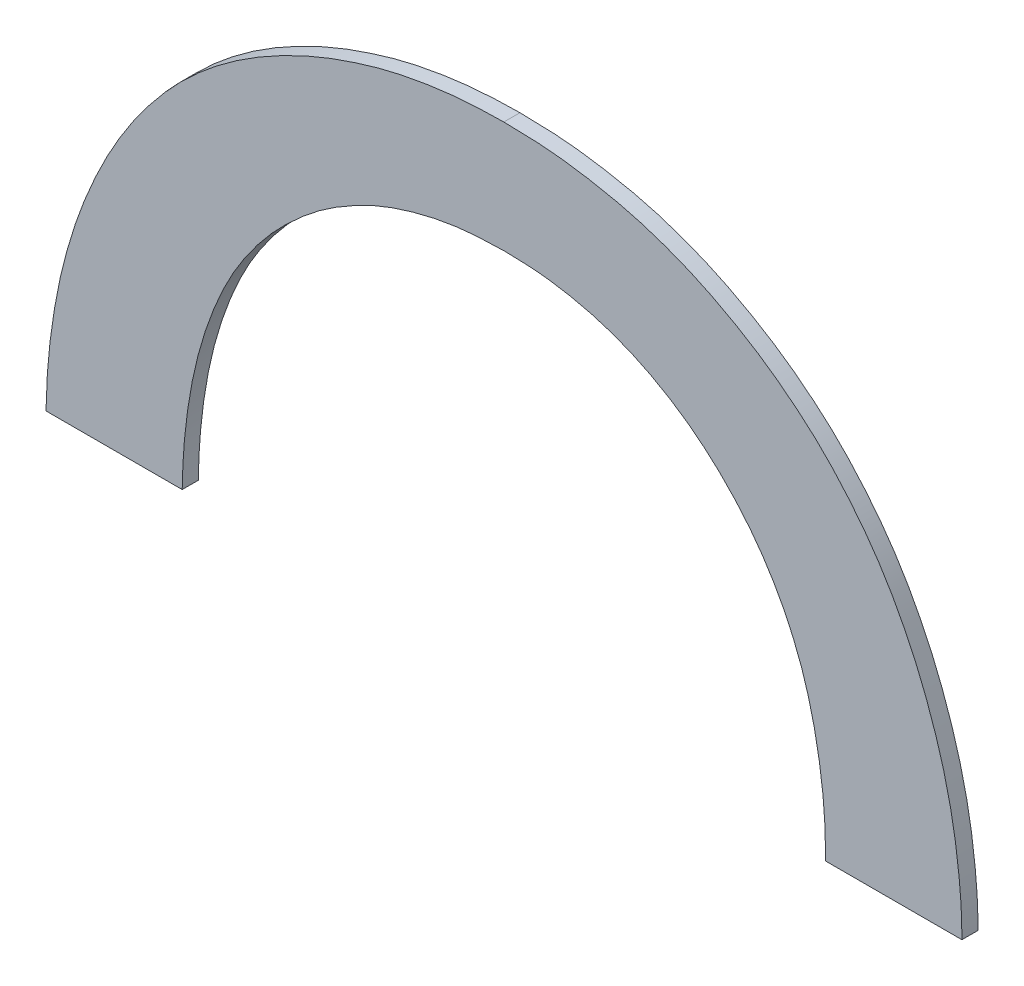
ISO-10303-21;
HEADER;
FILE_DESCRIPTION(('STEP AP214'),'2;1');
FILE_NAME('part.step','',(''),(''),'','','');
FILE_SCHEMA(('AUTOMOTIVE_DESIGN { 1 0 10303 214 1 1 1 1 }'));
ENDSEC;
DATA;
#1=APPLICATION_CONTEXT('core data for automotive mechanical design processes');
#2=APPLICATION_PROTOCOL_DEFINITION('international standard','automotive_design',2000,#1);
#3=PRODUCT_CONTEXT('',#1,'mechanical');
#4=PRODUCT('Part','Part','',(#3));
#5=PRODUCT_RELATED_PRODUCT_CATEGORY('part','',(#4));
#6=PRODUCT_DEFINITION_FORMATION('','',#4);
#7=PRODUCT_DEFINITION_CONTEXT('part definition',#1,'design');
#8=PRODUCT_DEFINITION('design','',#6,#7);
#9=PRODUCT_DEFINITION_SHAPE('','',#8);
#10=(LENGTH_UNIT() NAMED_UNIT(*) SI_UNIT(.MILLI.,.METRE.));
#11=(NAMED_UNIT(*) PLANE_ANGLE_UNIT() SI_UNIT($,.RADIAN.));
#12=(NAMED_UNIT(*) SI_UNIT($,.STERADIAN.) SOLID_ANGLE_UNIT());
#13=UNCERTAINTY_MEASURE_WITH_UNIT(LENGTH_MEASURE(1.E-05),#10,'distance_accuracy_value','');
#14=(GEOMETRIC_REPRESENTATION_CONTEXT(3) GLOBAL_UNCERTAINTY_ASSIGNED_CONTEXT((#13)) GLOBAL_UNIT_ASSIGNED_CONTEXT((#10,
#11,#12)) REPRESENTATION_CONTEXT('',''));
#15=CARTESIAN_POINT('',(0.,0.,0.));
#16=DIRECTION('',(0.,0.,1.));
#17=DIRECTION('',(1.,0.,0.));
#18=AXIS2_PLACEMENT_3D('',#15,#16,#17);
#19=CARTESIAN_POINT('',(10.3525266492303,11.0243893653808,0.5));
#20=DIRECTION('',(0.,0.,1.));
#21=DIRECTION('',(1.,0.,0.));
#22=AXIS2_PLACEMENT_3D('',#19,#20,#21);
#23=PLANE('',#22);
#24=CARTESIAN_POINT('',(0.,15.3846153846154,0.5));
#25=CARTESIAN_POINT('',(0.344753220200929,15.3792741721511,0.5));
#26=CARTESIAN_POINT('',(1.02762300983373,15.3686945679062,0.5));
#27=CARTESIAN_POINT('',(2.03798960421313,15.2712905777936,0.5));
#28=CARTESIAN_POINT('',(3.01987915428358,15.1045464256907,0.5));
#29=CARTESIAN_POINT('',(3.97890854159104,14.89523667203,0.5));
#30=CARTESIAN_POINT('',(4.90440549489051,14.6013720957114,0.5));
#31=CARTESIAN_POINT('',(5.80411363734744,14.2551272073144,0.5));
#32=CARTESIAN_POINT('',(6.67136292867436,13.8361192631119,0.5));
#33=CARTESIAN_POINT('',(7.51060874059996,13.3627869876404,0.5));
#34=CARTESIAN_POINT('',(8.31433313373731,12.8380286756876,0.5));
#35=CARTESIAN_POINT('',(9.06549584858372,12.2567927109984,0.5));
#36=CARTESIAN_POINT('',(9.77518030991208,11.6394887446928,0.5));
#37=CARTESIAN_POINT('',(10.4217724590289,10.9621836503208,0.5));
#38=CARTESIAN_POINT('',(11.0246372081747,10.2460658482216,0.5));
#39=CARTESIAN_POINT('',(11.5817499222166,9.48492067085225,0.5));
#40=CARTESIAN_POINT('',(12.0852386965378,8.67493533142775,0.5));
#41=CARTESIAN_POINT('',(12.5323134067004,7.82044261361452,0.5));
#42=CARTESIAN_POINT('',(12.9354561659615,6.94312771420891,0.5));
#43=CARTESIAN_POINT('',(13.2752965683784,6.04344848223068,0.5));
#44=CARTESIAN_POINT('',(13.5739000583611,5.13446643127678,0.5));
#45=CARTESIAN_POINT('',(13.8117199526514,4.21063152423738,0.5));
#46=CARTESIAN_POINT('',(14.0012301384877,3.27406085760122,0.5));
#47=CARTESIAN_POINT('',(14.128662792464,2.32631659269619,0.5));
#48=CARTESIAN_POINT('',(14.2206954019419,1.36598622398732,0.5));
#49=CARTESIAN_POINT('',(14.2273943895153,0.721377853966235,0.5));
#50=CARTESIAN_POINT('',(14.2307692307692,0.396634615384615,0.5));
#51=B_SPLINE_CURVE_WITH_KNOTS('',3,(#24,#25,#26,#27,#28,#29,#30,#31,#32,#33,#34,#35,#36,#37,#38,
#39,#40,#41,#42,#43,#44,#45,#46,#47,#48,#49,#50),.UNSPECIFIED.,.F.,.F.,(4,1,1,1,1,1,1,1,1,1,1,1,
1,1,1,1,1,1,1,1,1,1,1,1,4),(0.,0.0447019208074968,0.0885433100239245,0.131465288215882,
0.17381664158036,0.215721845749897,0.257259045342728,0.298740966032636,0.340501781719904,
0.38214850876387,0.423093318019024,0.463588147888226,0.504007911583259,0.544388418588891,
0.584918231759648,0.626224069925554,0.667942846682859,0.709910813343168,0.751354483462901,
0.792595733312486,0.833930154293738,0.874994289638587,0.916436331291352,0.957901979455649,1.),.UNSPECIFIED.);
#52=CARTESIAN_POINT('',(0.,15.3846153846154,0.5));
#53=VERTEX_POINT('',#52);
#54=CARTESIAN_POINT('',(14.2296783956234,0.5,0.5));
#55=VERTEX_POINT('',#54);
#56=EDGE_CURVE('E100',#53,#55,#51,.T.);
#57=ORIENTED_EDGE('',*,*,#56,.T.);
#58=DIRECTION('',(-1.,0.,0.));
#59=VECTOR('',#58,1.);
#60=CARTESIAN_POINT('',(10.3525266492303,0.5,0.5));
#61=LINE('',#60,#59);
#62=CARTESIAN_POINT('',(9.99917109614636,0.5,0.5));
#63=VERTEX_POINT('',#62);
#64=EDGE_CURVE('E114',#55,#63,#61,.T.);
#65=ORIENTED_EDGE('',*,*,#64,.T.);
#66=CARTESIAN_POINT('',(10.,0.444711538461538,0.5));
#67=CARTESIAN_POINT('',(9.99352021892729,0.877829097718419,0.5));
#68=CARTESIAN_POINT('',(9.98088510314185,1.72237777127866,0.5));
#69=CARTESIAN_POINT('',(9.83619969510625,2.95365295059749,0.5));
#70=CARTESIAN_POINT('',(9.61692087018172,4.11554271981961,0.5));
#71=CARTESIAN_POINT('',(9.31378365985646,5.21076418509407,0.5));
#72=CARTESIAN_POINT('',(8.90905851420964,6.23126610931418,0.5));
#73=CARTESIAN_POINT('',(8.41423432900512,7.17900816005998,0.5));
#74=CARTESIAN_POINT('',(7.83379331998171,8.05846989124861,0.5));
#75=CARTESIAN_POINT('',(7.1680409104972,8.85968466447942,0.5));
#76=CARTESIAN_POINT('',(6.43652575358211,9.57968354616591,0.5));
#77=CARTESIAN_POINT('',(5.65481474581481,10.20883934601,0.5));
#78=CARTESIAN_POINT('',(4.82363410622038,10.7334705604199,0.5));
#79=CARTESIAN_POINT('',(3.95398854765655,11.1716737690888,0.5));
#80=CARTESIAN_POINT('',(3.03434768870847,11.5093077347265,0.5));
#81=CARTESIAN_POINT('',(2.06911748935067,11.7479847028569,0.5));
#82=CARTESIAN_POINT('',(1.0583168845666,11.896964656081,0.5));
#83=CARTESIAN_POINT('',(0.369111702242908,11.9142643933377,0.5));
#84=CARTESIAN_POINT('',(0.0180288461538412,11.9230769230769,0.5));
#85=B_SPLINE_CURVE_WITH_KNOTS('',3,(#66,#67,#68,#69,#70,#71,#72,#73,#74,#75,#76,#77,#78,#79,#80,
#81,#82,#83,#84),.UNSPECIFIED.,.F.,.F.,(4,1,1,1,1,1,1,1,1,1,1,1,1,1,1,1,4),(0.,
0.0759760013778242,0.148147840729764,0.217233774793934,0.283343165506864,0.347254881251357,
0.409524007156626,0.470659415698186,0.531831202337304,0.591991495477476,0.650519001859518,
0.70757300758043,0.764172461786213,0.821120223613073,0.879100355202932,0.938413416375657,1.),.UNSPECIFIED.);
#86=CARTESIAN_POINT('',(0.0180288461538412,11.9230769230769,0.500000000000001));
#87=VERTEX_POINT('',#86);
#88=EDGE_CURVE('E117',#63,#87,#85,.T.);
#89=ORIENTED_EDGE('',*,*,#88,.T.);
#90=CARTESIAN_POINT('',(0.0180288461538412,11.9230769230769,0.5));
#91=CARTESIAN_POINT('',(-0.339008040595541,11.9141404113355,0.5));
#92=CARTESIAN_POINT('',(-1.03808525839421,11.8966427465369,0.5));
#93=CARTESIAN_POINT('',(-2.06408025768524,11.750176047351,0.5));
#94=CARTESIAN_POINT('',(-3.03889044603037,11.5008227708652,0.5));
#95=CARTESIAN_POINT('',(-3.97217752811076,11.1688769531684,0.5));
#96=CARTESIAN_POINT('',(-4.84707006275444,10.7201432432575,0.5));
#97=CARTESIAN_POINT('',(-5.68402368648533,10.1946769013211,0.5));
#98=CARTESIAN_POINT('',(-6.46024410726022,9.55257835313462,0.5));
#99=CARTESIAN_POINT('',(-7.19470277260044,8.83128490656962,0.5));
#100=CARTESIAN_POINT('',(-7.85370899288998,8.01149444458212,0.5));
#101=CARTESIAN_POINT('',(-8.4374977705082,7.11297080782485,0.5));
#102=CARTESIAN_POINT('',(-8.91499845115373,6.12454814133799,0.5));
#103=CARTESIAN_POINT('',(-9.31331960527374,5.0604414301481,0.5));
#104=CARTESIAN_POINT('',(-9.62576962172589,3.91397278976917,0.5));
#105=CARTESIAN_POINT('',(-9.84420143624477,2.68515228332696,0.5));
#106=CARTESIAN_POINT('',(-9.9789065538802,1.37721909028968,0.5));
#107=CARTESIAN_POINT('',(-9.99284452660626,0.479103322733377,0.5));
#108=CARTESIAN_POINT('',(-10.,0.0180288461538464,0.5));
#109=B_SPLINE_CURVE_WITH_KNOTS('',3,(#90,#91,#92,#93,#94,#95,#96,#97,#98,#99,#100,#101,#102,
#103,#104,#105,#106,#107,#108),.UNSPECIFIED.,.F.,.F.,(4,1,1,1,1,1,1,1,1,1,1,1,1,1,1,1,4),(0.,
0.0610568331758596,0.119549107244312,0.176811920441053,0.232963814303857,0.288592571832019,
0.344677508575926,0.401674151352184,0.460554590765406,0.520493442029477,0.581231156452735,
0.643451008851642,0.707862032340736,0.775363674324027,0.846408843832957,0.9211494057947,1.),.UNSPECIFIED.);
#110=CARTESIAN_POINT('',(-9.99164782223736,0.499999999999184,0.5));
#111=VERTEX_POINT('',#110);
#112=EDGE_CURVE('E149',#87,#111,#109,.T.);
#113=ORIENTED_EDGE('',*,*,#112,.T.);
#114=CARTESIAN_POINT('',(-14.2224442114594,0.5,0.5));
#115=VERTEX_POINT('',#114);
#116=EDGE_CURVE('E80',#111,#115,#61,.T.);
#117=ORIENTED_EDGE('',*,*,#116,.T.);
#118=CARTESIAN_POINT('',(-14.2307692307692,0.0480769230769233,0.5));
#119=CARTESIAN_POINT('',(-14.2245185235357,0.420809036747173,0.5));
#120=CARTESIAN_POINT('',(-14.2121691736018,1.15720559657745,0.5));
#121=CARTESIAN_POINT('',(-14.1286084187029,2.24508862312763,0.5));
#122=CARTESIAN_POINT('',(-13.9816795673641,3.30174078414195,0.5));
#123=CARTESIAN_POINT('',(-13.7868034616448,4.33031282561474,0.5));
#124=CARTESIAN_POINT('',(-13.5256754306759,5.32866347319633,0.5));
#125=CARTESIAN_POINT('',(-13.215364889533,6.29965506418861,0.5));
#126=CARTESIAN_POINT('',(-12.8400267745373,7.23750416109316,0.5));
#127=CARTESIAN_POINT('',(-12.4161239875513,8.14447123976062,0.5));
#128=CARTESIAN_POINT('',(-11.9364783762358,9.00808211626406,0.5));
#129=CARTESIAN_POINT('',(-11.4073959542526,9.82229888659056,0.5));
#130=CARTESIAN_POINT('',(-10.8285053749589,10.579502035299,0.5));
#131=CARTESIAN_POINT('',(-10.2085872736321,11.2889920904243,0.5));
#132=CARTESIAN_POINT('',(-9.53524756709915,11.936083209771,0.5));
#133=CARTESIAN_POINT('',(-8.81368718160546,12.5304069168618,0.5));
#134=CARTESIAN_POINT('',(-8.04538168279164,13.0694060831132,0.5));
#135=CARTESIAN_POINT('',(-7.23334269410256,13.5562599990873,0.5));
#136=CARTESIAN_POINT('',(-6.39054380837594,13.9843498279604,0.5));
#137=CARTESIAN_POINT('',(-5.52721831281684,14.362662410738,0.5));
#138=CARTESIAN_POINT('',(-4.64234803529465,14.6687496998762,0.5));
#139=CARTESIAN_POINT('',(-3.74887879752086,14.9402358589999,0.5));
#140=CARTESIAN_POINT('',(-2.83350619956188,15.1354482666034,0.500000000000001));
#141=CARTESIAN_POINT('',(-1.90486176994163,15.2809129777081,0.499999999999999));
#142=CARTESIAN_POINT('',(-0.95711101538129,15.3659735209081,0.5));
#143=CARTESIAN_POINT('',(-0.320676423354294,15.3783694987336,0.5));
#144=CARTESIAN_POINT('',(0.,15.3846153846154,0.5));
#145=B_SPLINE_CURVE_WITH_KNOTS('',3,(#118,#119,#120,#121,#122,#123,#124,#125,#126,#127,#128,
#129,#130,#131,#132,#133,#134,#135,#136,#137,#138,#139,#140,#141,#142,#143,#144),.UNSPECIFIED.,
.F.,.F.,(4,1,1,1,1,1,1,1,1,1,1,1,1,1,1,1,1,1,1,1,1,1,1,1,4),(0.,0.0475607904469535,
0.0939645423171941,0.139115141345361,0.183631072801197,0.227462927902264,0.270709531701966,
0.313618666161367,0.356269691332142,0.398376485288319,0.439567915657715,0.480057833850516,
0.519901979935957,0.559672266034351,0.599076979077249,0.639073336918097,0.679315608028187,
0.719783735968342,0.759623782313469,0.799480225089592,0.839192146933082,0.87870035522447,
0.918792163087699,0.959082301597663,1.),.UNSPECIFIED.);
#146=EDGE_CURVE('E93',#115,#53,#145,.T.);
#147=ORIENTED_EDGE('',*,*,#146,.T.);
#148=EDGE_LOOP('',(#57,#65,#89,#113,#117,#147));
#149=FACE_BOUND('',#148,.T.);
#150=ADVANCED_FACE('F39',(#149),#23,.F.);
#151=CARTESIAN_POINT('',(10.3525266492303,11.0243893653808,1.));
#152=DIRECTION('',(0.,0.,1.));
#153=DIRECTION('',(1.,0.,0.));
#154=AXIS2_PLACEMENT_3D('',#151,#152,#153);
#155=PLANE('',#154);
#156=CARTESIAN_POINT('',(-14.2307692307692,0.0480769230769233,1.));
#157=CARTESIAN_POINT('',(-14.2245185235357,0.420809036747173,1.));
#158=CARTESIAN_POINT('',(-14.2121691736018,1.15720559657745,1.));
#159=CARTESIAN_POINT('',(-14.1286084187029,2.24508862312763,1.));
#160=CARTESIAN_POINT('',(-13.9816795673641,3.30174078414195,1.));
#161=CARTESIAN_POINT('',(-13.7868034616448,4.33031282561474,1.));
#162=CARTESIAN_POINT('',(-13.5256754306759,5.32866347319633,1.));
#163=CARTESIAN_POINT('',(-13.215364889533,6.29965506418861,1.));
#164=CARTESIAN_POINT('',(-12.8400267745373,7.23750416109316,1.));
#165=CARTESIAN_POINT('',(-12.4161239875513,8.14447123976062,1.));
#166=CARTESIAN_POINT('',(-11.9364783762358,9.00808211626406,1.));
#167=CARTESIAN_POINT('',(-11.4073959542526,9.82229888659056,1.));
#168=CARTESIAN_POINT('',(-10.8285053749589,10.579502035299,1.));
#169=CARTESIAN_POINT('',(-10.2085872736321,11.2889920904243,1.));
#170=CARTESIAN_POINT('',(-9.53524756709915,11.936083209771,1.));
#171=CARTESIAN_POINT('',(-8.81368718160546,12.5304069168618,1.));
#172=CARTESIAN_POINT('',(-8.04538168279164,13.0694060831132,1.));
#173=CARTESIAN_POINT('',(-7.23334269410256,13.5562599990873,1.));
#174=CARTESIAN_POINT('',(-6.39054380837594,13.9843498279604,1.));
#175=CARTESIAN_POINT('',(-5.52721831281684,14.362662410738,1.));
#176=CARTESIAN_POINT('',(-4.64234803529465,14.6687496998762,1.));
#177=CARTESIAN_POINT('',(-3.74887879752086,14.9402358589999,1.));
#178=CARTESIAN_POINT('',(-2.83350619956188,15.1354482666034,1.));
#179=CARTESIAN_POINT('',(-1.90486176994163,15.2809129777081,0.999999999999999));
#180=CARTESIAN_POINT('',(-0.95711101538129,15.3659735209081,1.));
#181=CARTESIAN_POINT('',(-0.320676423354294,15.3783694987336,1.));
#182=CARTESIAN_POINT('',(0.,15.3846153846154,1.));
#183=B_SPLINE_CURVE_WITH_KNOTS('',3,(#156,#157,#158,#159,#160,#161,#162,#163,#164,#165,#166,
#167,#168,#169,#170,#171,#172,#173,#174,#175,#176,#177,#178,#179,#180,#181,#182),.UNSPECIFIED.,
.F.,.F.,(4,1,1,1,1,1,1,1,1,1,1,1,1,1,1,1,1,1,1,1,1,1,1,1,4),(0.,0.0475607904469535,
0.0939645423171941,0.139115141345361,0.183631072801197,0.227462927902264,0.270709531701966,
0.313618666161367,0.356269691332142,0.398376485288319,0.439567915657715,0.480057833850516,
0.519901979935957,0.559672266034351,0.599076979077249,0.639073336918097,0.679315608028187,
0.719783735968342,0.759623782313469,0.799480225089592,0.839192146933082,0.87870035522447,
0.918792163087699,0.959082301597663,1.),.UNSPECIFIED.);
#184=CARTESIAN_POINT('',(-14.2224442114594,0.5,1.));
#185=VERTEX_POINT('',#184);
#186=CARTESIAN_POINT('',(0.,15.3846153846154,1.));
#187=VERTEX_POINT('',#186);
#188=EDGE_CURVE('E107',#185,#187,#183,.T.);
#189=ORIENTED_EDGE('',*,*,#188,.F.);
#190=DIRECTION('',(1.,0.,0.));
#191=VECTOR('',#190,1.);
#192=CARTESIAN_POINT('',(-17.,0.5,1.));
#193=LINE('',#192,#191);
#194=CARTESIAN_POINT('',(-9.99164782223735,0.5,1.));
#195=VERTEX_POINT('',#194);
#196=EDGE_CURVE('E99',#185,#195,#193,.T.);
#197=ORIENTED_EDGE('',*,*,#196,.T.);
#198=CARTESIAN_POINT('',(0.0180288461538412,11.9230769230769,1.));
#199=CARTESIAN_POINT('',(-0.339008040595541,11.9141404113355,1.));
#200=CARTESIAN_POINT('',(-1.03808525839421,11.8966427465369,1.));
#201=CARTESIAN_POINT('',(-2.06408025768524,11.750176047351,1.));
#202=CARTESIAN_POINT('',(-3.03889044603037,11.5008227708652,1.));
#203=CARTESIAN_POINT('',(-3.97217752811076,11.1688769531684,1.));
#204=CARTESIAN_POINT('',(-4.84707006275444,10.7201432432575,1.));
#205=CARTESIAN_POINT('',(-5.68402368648533,10.1946769013211,1.));
#206=CARTESIAN_POINT('',(-6.46024410726022,9.55257835313462,1.));
#207=CARTESIAN_POINT('',(-7.19470277260044,8.83128490656962,1.));
#208=CARTESIAN_POINT('',(-7.85370899288998,8.01149444458212,1.));
#209=CARTESIAN_POINT('',(-8.4374977705082,7.11297080782485,1.));
#210=CARTESIAN_POINT('',(-8.91499845115373,6.12454814133799,1.));
#211=CARTESIAN_POINT('',(-9.31331960527374,5.0604414301481,1.));
#212=CARTESIAN_POINT('',(-9.62576962172589,3.91397278976917,1.));
#213=CARTESIAN_POINT('',(-9.84420143624477,2.68515228332696,1.));
#214=CARTESIAN_POINT('',(-9.9789065538802,1.37721909028968,1.));
#215=CARTESIAN_POINT('',(-9.99284452660626,0.479103322733377,1.));
#216=CARTESIAN_POINT('',(-10.,0.0180288461538464,1.));
#217=B_SPLINE_CURVE_WITH_KNOTS('',3,(#198,#199,#200,#201,#202,#203,#204,#205,#206,#207,#208,
#209,#210,#211,#212,#213,#214,#215,#216),.UNSPECIFIED.,.F.,.F.,(4,1,1,1,1,1,1,1,1,1,1,1,1,1,1,1,
4),(0.,0.0610568331758596,0.119549107244312,0.176811920441053,0.232963814303857,
0.288592571832019,0.344677508575926,0.401674151352184,0.460554590765406,0.520493442029477,
0.581231156452735,0.643451008851642,0.707862032340736,0.775363674324027,0.846408843832957,
0.9211494057947,1.),.UNSPECIFIED.);
#218=CARTESIAN_POINT('',(0.0180288461538412,11.9230769230769,1.));
#219=VERTEX_POINT('',#218);
#220=EDGE_CURVE('E160',#219,#195,#217,.T.);
#221=ORIENTED_EDGE('',*,*,#220,.F.);
#222=CARTESIAN_POINT('',(10.,0.444711538461538,1.));
#223=CARTESIAN_POINT('',(9.99352021892729,0.877829097718419,1.));
#224=CARTESIAN_POINT('',(9.98088510314185,1.72237777127866,1.));
#225=CARTESIAN_POINT('',(9.83619969510625,2.95365295059749,1.));
#226=CARTESIAN_POINT('',(9.61692087018172,4.11554271981961,1.));
#227=CARTESIAN_POINT('',(9.31378365985646,5.21076418509407,1.));
#228=CARTESIAN_POINT('',(8.90905851420964,6.23126610931418,1.));
#229=CARTESIAN_POINT('',(8.41423432900512,7.17900816005998,1.));
#230=CARTESIAN_POINT('',(7.83379331998171,8.05846989124861,1.));
#231=CARTESIAN_POINT('',(7.1680409104972,8.85968466447942,1.));
#232=CARTESIAN_POINT('',(6.43652575358211,9.57968354616591,1.));
#233=CARTESIAN_POINT('',(5.65481474581481,10.20883934601,1.));
#234=CARTESIAN_POINT('',(4.82363410622038,10.7334705604199,1.));
#235=CARTESIAN_POINT('',(3.95398854765655,11.1716737690888,1.));
#236=CARTESIAN_POINT('',(3.03434768870847,11.5093077347265,1.));
#237=CARTESIAN_POINT('',(2.06911748935067,11.7479847028569,1.));
#238=CARTESIAN_POINT('',(1.0583168845666,11.896964656081,1.));
#239=CARTESIAN_POINT('',(0.369111702242908,11.9142643933377,1.));
#240=CARTESIAN_POINT('',(0.0180288461538412,11.9230769230769,1.));
#241=B_SPLINE_CURVE_WITH_KNOTS('',3,(#222,#223,#224,#225,#226,#227,#228,#229,#230,#231,#232,
#233,#234,#235,#236,#237,#238,#239,#240),.UNSPECIFIED.,.F.,.F.,(4,1,1,1,1,1,1,1,1,1,1,1,1,1,1,1,
4),(0.,0.0759760013778242,0.148147840729764,0.217233774793934,0.283343165506864,
0.347254881251357,0.409524007156626,0.470659415698186,0.531831202337304,0.591991495477476,
0.650519001859518,0.70757300758043,0.764172461786213,0.821120223613073,0.879100355202932,
0.938413416375657,1.),.UNSPECIFIED.);
#242=CARTESIAN_POINT('',(9.99917109614636,0.5,1.));
#243=VERTEX_POINT('',#242);
#244=EDGE_CURVE('E11',#243,#219,#241,.T.);
#245=ORIENTED_EDGE('',*,*,#244,.F.);
#246=CARTESIAN_POINT('',(14.2296783956234,0.5,1.));
#247=VERTEX_POINT('',#246);
#248=EDGE_CURVE('E43',#243,#247,#193,.T.);
#249=ORIENTED_EDGE('',*,*,#248,.T.);
#250=CARTESIAN_POINT('',(0.,15.3846153846154,1.));
#251=CARTESIAN_POINT('',(0.344753220200929,15.3792741721511,1.));
#252=CARTESIAN_POINT('',(1.02762300983373,15.3686945679062,1.));
#253=CARTESIAN_POINT('',(2.03798960421313,15.2712905777936,1.));
#254=CARTESIAN_POINT('',(3.01987915428358,15.1045464256907,1.));
#255=CARTESIAN_POINT('',(3.97890854159104,14.89523667203,1.));
#256=CARTESIAN_POINT('',(4.90440549489051,14.6013720957114,1.));
#257=CARTESIAN_POINT('',(5.80411363734744,14.2551272073144,1.));
#258=CARTESIAN_POINT('',(6.67136292867436,13.8361192631119,1.));
#259=CARTESIAN_POINT('',(7.51060874059996,13.3627869876404,1.));
#260=CARTESIAN_POINT('',(8.31433313373731,12.8380286756876,1.));
#261=CARTESIAN_POINT('',(9.06549584858372,12.2567927109984,1.));
#262=CARTESIAN_POINT('',(9.77518030991208,11.6394887446928,1.));
#263=CARTESIAN_POINT('',(10.4217724590289,10.9621836503208,1.));
#264=CARTESIAN_POINT('',(11.0246372081747,10.2460658482216,1.));
#265=CARTESIAN_POINT('',(11.5817499222166,9.48492067085225,1.));
#266=CARTESIAN_POINT('',(12.0852386965378,8.67493533142775,1.));
#267=CARTESIAN_POINT('',(12.5323134067004,7.82044261361452,1.));
#268=CARTESIAN_POINT('',(12.9354561659615,6.94312771420891,1.));
#269=CARTESIAN_POINT('',(13.2752965683784,6.04344848223068,1.));
#270=CARTESIAN_POINT('',(13.5739000583611,5.13446643127678,1.));
#271=CARTESIAN_POINT('',(13.8117199526514,4.21063152423738,1.));
#272=CARTESIAN_POINT('',(14.0012301384877,3.27406085760122,1.));
#273=CARTESIAN_POINT('',(14.128662792464,2.32631659269619,1.));
#274=CARTESIAN_POINT('',(14.2206954019419,1.36598622398732,1.));
#275=CARTESIAN_POINT('',(14.2273943895153,0.721377853966235,1.));
#276=CARTESIAN_POINT('',(14.2307692307692,0.396634615384615,1.));
#277=B_SPLINE_CURVE_WITH_KNOTS('',3,(#250,#251,#252,#253,#254,#255,#256,#257,#258,#259,#260,
#261,#262,#263,#264,#265,#266,#267,#268,#269,#270,#271,#272,#273,#274,#275,#276),.UNSPECIFIED.,
.F.,.F.,(4,1,1,1,1,1,1,1,1,1,1,1,1,1,1,1,1,1,1,1,1,1,1,1,4),(0.,0.0447019208074968,
0.0885433100239245,0.131465288215882,0.17381664158036,0.215721845749897,0.257259045342728,
0.298740966032636,0.340501781719904,0.38214850876387,0.423093318019024,0.463588147888226,
0.504007911583259,0.544388418588891,0.584918231759648,0.626224069925554,0.667942846682859,
0.709910813343168,0.751354483462901,0.792595733312486,0.833930154293738,0.874994289638587,
0.916436331291352,0.957901979455649,1.),.UNSPECIFIED.);
#278=EDGE_CURVE('E156',#187,#247,#277,.T.);
#279=ORIENTED_EDGE('',*,*,#278,.F.);
#280=EDGE_LOOP('',(#189,#197,#221,#245,#249,#279));
#281=FACE_BOUND('',#280,.T.);
#282=ADVANCED_FACE('F41',(#281),#155,.T.);
#283=DIRECTION('',(0.,0.,1.));
#284=VECTOR('',#283,1.);
#285=SURFACE_OF_LINEAR_EXTRUSION('',#51,#284);
#286=ORIENTED_EDGE('',*,*,#278,.T.);
#287=DIRECTION('',(0.,0.,1.));
#288=VECTOR('',#287,1.);
#289=CARTESIAN_POINT('',(14.2296783956233,0.499999999999995,0.5));
#290=LINE('',#289,#288);
#291=EDGE_CURVE('E108',#247,#55,#290,.F.);
#292=ORIENTED_EDGE('',*,*,#291,.T.);
#293=ORIENTED_EDGE('',*,*,#56,.F.);
#294=DIRECTION('',(0.,0.,1.));
#295=VECTOR('',#294,1.);
#296=CARTESIAN_POINT('',(0.,15.3846153846154,0.5));
#297=LINE('',#296,#295);
#298=EDGE_CURVE('E104',#53,#187,#297,.T.);
#299=ORIENTED_EDGE('',*,*,#298,.T.);
#300=EDGE_LOOP('',(#286,#292,#293,#299));
#301=FACE_BOUND('',#300,.T.);
#302=ADVANCED_FACE('F111',(#301),#285,.F.);
#303=DIRECTION('',(0.,0.,1.));
#304=VECTOR('',#303,1.);
#305=SURFACE_OF_LINEAR_EXTRUSION('',#145,#304);
#306=ORIENTED_EDGE('',*,*,#146,.F.);
#307=DIRECTION('',(0.,0.,1.));
#308=VECTOR('',#307,1.);
#309=CARTESIAN_POINT('',(-14.2224442114595,0.5,0.5));
#310=LINE('',#309,#308);
#311=EDGE_CURVE('E60',#115,#185,#310,.T.);
#312=ORIENTED_EDGE('',*,*,#311,.T.);
#313=ORIENTED_EDGE('',*,*,#188,.T.);
#314=ORIENTED_EDGE('',*,*,#298,.F.);
#315=EDGE_LOOP('',(#306,#312,#313,#314));
#316=FACE_BOUND('',#315,.T.);
#317=ADVANCED_FACE('F101',(#316),#305,.F.);
#318=DIRECTION('',(0.,0.,1.));
#319=VECTOR('',#318,1.);
#320=SURFACE_OF_LINEAR_EXTRUSION('',#109,#319);
#321=ORIENTED_EDGE('',*,*,#220,.T.);
#322=DIRECTION('',(0.,0.,1.));
#323=VECTOR('',#322,1.);
#324=CARTESIAN_POINT('',(-9.99164782223735,0.5,0.5));
#325=LINE('',#324,#323);
#326=EDGE_CURVE('E78',#195,#111,#325,.F.);
#327=ORIENTED_EDGE('',*,*,#326,.T.);
#328=ORIENTED_EDGE('',*,*,#112,.F.);
#329=DIRECTION('',(0.,0.,1.));
#330=VECTOR('',#329,1.);
#331=CARTESIAN_POINT('',(0.0180288461538412,11.9230769230769,0.5));
#332=LINE('',#331,#330);
#333=EDGE_CURVE('E124',#87,#219,#332,.T.);
#334=ORIENTED_EDGE('',*,*,#333,.T.);
#335=EDGE_LOOP('',(#321,#327,#328,#334));
#336=FACE_BOUND('',#335,.T.);
#337=ADVANCED_FACE('F134',(#336),#320,.F.);
#338=DIRECTION('',(0.,0.,1.));
#339=VECTOR('',#338,1.);
#340=SURFACE_OF_LINEAR_EXTRUSION('',#85,#339);
#341=ORIENTED_EDGE('',*,*,#88,.F.);
#342=DIRECTION('',(0.,0.,1.));
#343=VECTOR('',#342,1.);
#344=CARTESIAN_POINT('',(9.99917109614636,0.5,0.5));
#345=LINE('',#344,#343);
#346=EDGE_CURVE('E47',#63,#243,#345,.T.);
#347=ORIENTED_EDGE('',*,*,#346,.T.);
#348=ORIENTED_EDGE('',*,*,#244,.T.);
#349=ORIENTED_EDGE('',*,*,#333,.F.);
#350=EDGE_LOOP('',(#341,#347,#348,#349));
#351=FACE_BOUND('',#350,.T.);
#352=ADVANCED_FACE('F136',(#351),#340,.F.);
#353=CARTESIAN_POINT('',(-17.,0.5,1.));
#354=DIRECTION('',(0.,1.,0.));
#355=DIRECTION('',(0.,0.,1.));
#356=AXIS2_PLACEMENT_3D('',#353,#354,#355);
#357=PLANE('',#356);
#358=ORIENTED_EDGE('',*,*,#248,.F.);
#359=ORIENTED_EDGE('',*,*,#346,.F.);
#360=ORIENTED_EDGE('',*,*,#64,.F.);
#361=ORIENTED_EDGE('',*,*,#291,.F.);
#362=EDGE_LOOP('',(#358,#359,#360,#361));
#363=FACE_BOUND('',#362,.T.);
#364=ADVANCED_FACE('F139',(#363),#357,.F.);
#365=ORIENTED_EDGE('',*,*,#116,.F.);
#366=ORIENTED_EDGE('',*,*,#326,.F.);
#367=ORIENTED_EDGE('',*,*,#196,.F.);
#368=ORIENTED_EDGE('',*,*,#311,.F.);
#369=EDGE_LOOP('',(#365,#366,#367,#368));
#370=FACE_BOUND('',#369,.T.);
#371=ADVANCED_FACE('F195',(#370),#357,.F.);
#372=CLOSED_SHELL('',(#150,#282,#302,#317,#337,#352,#364,#371));
#373=MANIFOLD_SOLID_BREP('B2',#372);
#374=ADVANCED_BREP_SHAPE_REPRESENTATION('',(#18,#373),#14);
#375=SHAPE_DEFINITION_REPRESENTATION(#9,#374);
ENDSEC;
END-ISO-10303-21;
